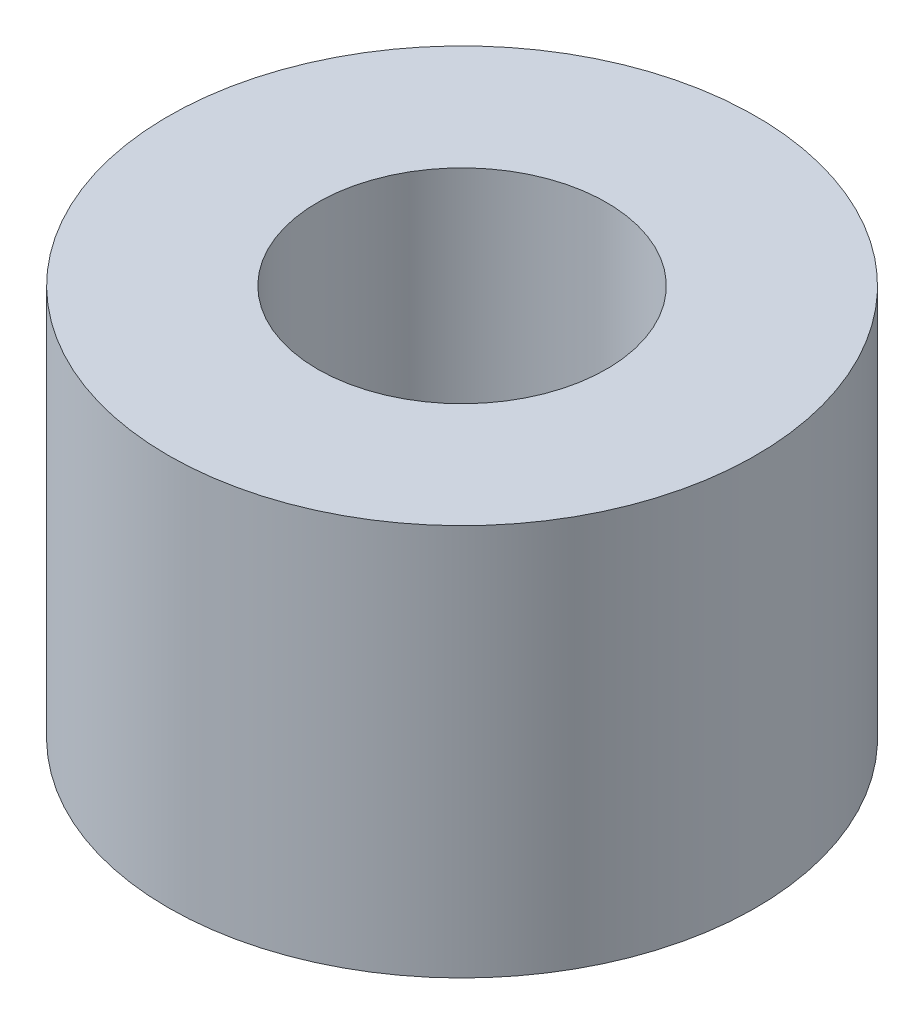
ISO-10303-21;
HEADER;
FILE_DESCRIPTION(('STEP AP214'),'2;1');
FILE_NAME('part.step','',(''),(''),'','','');
FILE_SCHEMA(('AUTOMOTIVE_DESIGN { 1 0 10303 214 1 1 1 1 }'));
ENDSEC;
DATA;
#1=APPLICATION_CONTEXT('core data for automotive mechanical design processes');
#2=APPLICATION_PROTOCOL_DEFINITION('international standard','automotive_design',2000,#1);
#3=PRODUCT_CONTEXT('',#1,'mechanical');
#4=PRODUCT('Part','Part','',(#3));
#5=PRODUCT_RELATED_PRODUCT_CATEGORY('part','',(#4));
#6=PRODUCT_DEFINITION_FORMATION('','',#4);
#7=PRODUCT_DEFINITION_CONTEXT('part definition',#1,'design');
#8=PRODUCT_DEFINITION('design','',#6,#7);
#9=PRODUCT_DEFINITION_SHAPE('','',#8);
#10=(LENGTH_UNIT() NAMED_UNIT(*) SI_UNIT(.MILLI.,.METRE.));
#11=(NAMED_UNIT(*) PLANE_ANGLE_UNIT() SI_UNIT($,.RADIAN.));
#12=(NAMED_UNIT(*) SI_UNIT($,.STERADIAN.) SOLID_ANGLE_UNIT());
#13=UNCERTAINTY_MEASURE_WITH_UNIT(LENGTH_MEASURE(1.E-05),#10,'distance_accuracy_value','');
#14=(GEOMETRIC_REPRESENTATION_CONTEXT(3) GLOBAL_UNCERTAINTY_ASSIGNED_CONTEXT((#13)) GLOBAL_UNIT_ASSIGNED_CONTEXT((#10,
#11,#12)) REPRESENTATION_CONTEXT('',''));
#15=CARTESIAN_POINT('',(0.,0.,0.));
#16=DIRECTION('',(0.,0.,1.));
#17=DIRECTION('',(1.,0.,0.));
#18=AXIS2_PLACEMENT_3D('',#15,#16,#17);
#19=CARTESIAN_POINT('',(0.,4.,0.));
#20=DIRECTION('',(0.,-1.,0.));
#21=DIRECTION('',(0.,0.,-1.));
#22=AXIS2_PLACEMENT_3D('',#19,#20,#21);
#23=CYLINDRICAL_SURFACE('',#22,3.);
#24=CARTESIAN_POINT('',(0.,4.,0.));
#25=DIRECTION('',(0.,1.,0.));
#26=DIRECTION('',(0.,0.,1.));
#27=AXIS2_PLACEMENT_3D('',#24,#25,#26);
#28=CIRCLE('',#27,3.);
#29=CARTESIAN_POINT('',(0.,4.,3.));
#30=VERTEX_POINT('',#29);
#31=EDGE_CURVE('E10',#30,#30,#28,.T.);
#32=ORIENTED_EDGE('',*,*,#31,.F.);
#33=EDGE_LOOP('',(#32));
#34=FACE_BOUND('',#33,.T.);
#35=CARTESIAN_POINT('',(0.,0.,0.));
#36=DIRECTION('',(0.,1.,0.));
#37=DIRECTION('',(0.,0.,1.));
#38=AXIS2_PLACEMENT_3D('',#35,#36,#37);
#39=CIRCLE('',#38,3.);
#40=CARTESIAN_POINT('',(0.,0.,3.));
#41=VERTEX_POINT('',#40);
#42=EDGE_CURVE('E46',#41,#41,#39,.T.);
#43=ORIENTED_EDGE('',*,*,#42,.T.);
#44=EDGE_LOOP('',(#43));
#45=FACE_BOUND('',#44,.T.);
#46=ADVANCED_FACE('F43',(#34,#45),#23,.T.);
#47=CARTESIAN_POINT('',(0.,4.,0.));
#48=DIRECTION('',(0.,1.,0.));
#49=DIRECTION('',(0.,0.,1.));
#50=AXIS2_PLACEMENT_3D('',#47,#48,#49);
#51=PLANE('',#50);
#52=CARTESIAN_POINT('',(0.,4.,0.));
#53=DIRECTION('',(0.,1.,0.));
#54=DIRECTION('',(0.,0.,1.));
#55=AXIS2_PLACEMENT_3D('',#52,#53,#54);
#56=CIRCLE('',#55,1.475);
#57=CARTESIAN_POINT('',(0.,4.,1.475));
#58=VERTEX_POINT('',#57);
#59=EDGE_CURVE('E57',#58,#58,#56,.T.);
#60=ORIENTED_EDGE('',*,*,#59,.F.);
#61=EDGE_LOOP('',(#60));
#62=FACE_BOUND('',#61,.T.);
#63=ORIENTED_EDGE('',*,*,#31,.T.);
#64=EDGE_LOOP('',(#63));
#65=FACE_BOUND('',#64,.T.);
#66=ADVANCED_FACE('F74',(#62,#65),#51,.T.);
#67=CARTESIAN_POINT('',(0.,0.,0.));
#68=DIRECTION('',(0.,1.,0.));
#69=DIRECTION('',(0.,0.,1.));
#70=AXIS2_PLACEMENT_3D('',#67,#68,#69);
#71=PLANE('',#70);
#72=CARTESIAN_POINT('',(0.,0.,0.));
#73=DIRECTION('',(0.,1.,0.));
#74=DIRECTION('',(0.,0.,1.));
#75=AXIS2_PLACEMENT_3D('',#72,#73,#74);
#76=CIRCLE('',#75,1.475);
#77=CARTESIAN_POINT('',(0.,0.,1.475));
#78=VERTEX_POINT('',#77);
#79=EDGE_CURVE('E55',#78,#78,#76,.T.);
#80=ORIENTED_EDGE('',*,*,#79,.T.);
#81=EDGE_LOOP('',(#80));
#82=FACE_BOUND('',#81,.T.);
#83=ORIENTED_EDGE('',*,*,#42,.F.);
#84=EDGE_LOOP('',(#83));
#85=FACE_BOUND('',#84,.T.);
#86=ADVANCED_FACE('F65',(#82,#85),#71,.F.);
#87=CARTESIAN_POINT('',(0.,0.,0.));
#88=DIRECTION('',(0.,1.,0.));
#89=DIRECTION('',(0.,0.,1.));
#90=AXIS2_PLACEMENT_3D('',#87,#88,#89);
#91=CYLINDRICAL_SURFACE('',#90,1.475);
#92=ORIENTED_EDGE('',*,*,#79,.F.);
#93=EDGE_LOOP('',(#92));
#94=FACE_BOUND('',#93,.T.);
#95=ORIENTED_EDGE('',*,*,#59,.T.);
#96=EDGE_LOOP('',(#95));
#97=FACE_BOUND('',#96,.T.);
#98=ADVANCED_FACE('F68',(#94,#97),#91,.F.);
#99=CLOSED_SHELL('',(#46,#66,#86,#98));
#100=MANIFOLD_SOLID_BREP('B2',#99);
#101=ADVANCED_BREP_SHAPE_REPRESENTATION('',(#18,#100),#14);
#102=SHAPE_DEFINITION_REPRESENTATION(#9,#101);
ENDSEC;
END-ISO-10303-21;
